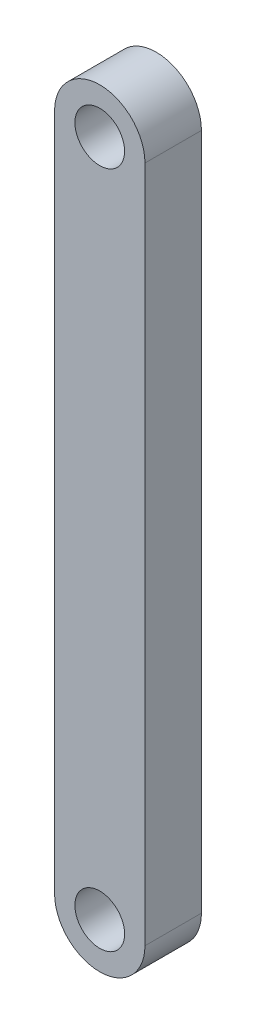
ISO-10303-21;
HEADER;
FILE_DESCRIPTION(('STEP AP214'),'2;1');
FILE_NAME('part.step','',(''),(''),'','','');
FILE_SCHEMA(('AUTOMOTIVE_DESIGN { 1 0 10303 214 1 1 1 1 }'));
ENDSEC;
DATA;
#1=APPLICATION_CONTEXT('core data for automotive mechanical design processes');
#2=APPLICATION_PROTOCOL_DEFINITION('international standard','automotive_design',2000,#1);
#3=PRODUCT_CONTEXT('',#1,'mechanical');
#4=PRODUCT('Part','Part','',(#3));
#5=PRODUCT_RELATED_PRODUCT_CATEGORY('part','',(#4));
#6=PRODUCT_DEFINITION_FORMATION('','',#4);
#7=PRODUCT_DEFINITION_CONTEXT('part definition',#1,'design');
#8=PRODUCT_DEFINITION('design','',#6,#7);
#9=PRODUCT_DEFINITION_SHAPE('','',#8);
#10=(LENGTH_UNIT() NAMED_UNIT(*) SI_UNIT(.MILLI.,.METRE.));
#11=(NAMED_UNIT(*) PLANE_ANGLE_UNIT() SI_UNIT($,.RADIAN.));
#12=(NAMED_UNIT(*) SI_UNIT($,.STERADIAN.) SOLID_ANGLE_UNIT());
#13=UNCERTAINTY_MEASURE_WITH_UNIT(LENGTH_MEASURE(1.E-05),#10,'distance_accuracy_value','');
#14=(GEOMETRIC_REPRESENTATION_CONTEXT(3) GLOBAL_UNCERTAINTY_ASSIGNED_CONTEXT((#13)) GLOBAL_UNIT_ASSIGNED_CONTEXT((#10,
#11,#12)) REPRESENTATION_CONTEXT('',''));
#15=CARTESIAN_POINT('',(0.,0.,0.));
#16=DIRECTION('',(0.,0.,1.));
#17=DIRECTION('',(1.,0.,0.));
#18=AXIS2_PLACEMENT_3D('',#15,#16,#17);
#19=CARTESIAN_POINT('',(0.,60.,5.));
#20=DIRECTION('',(0.,0.,1.));
#21=DIRECTION('',(1.,0.,0.));
#22=AXIS2_PLACEMENT_3D('',#19,#20,#21);
#23=PLANE('',#22);
#24=CARTESIAN_POINT('',(0.,0.,5.));
#25=DIRECTION('',(0.,0.,1.));
#26=DIRECTION('',(1.,0.,0.));
#27=AXIS2_PLACEMENT_3D('',#24,#25,#26);
#28=CIRCLE('',#27,2.2);
#29=CARTESIAN_POINT('',(2.2,0.,5.));
#30=VERTEX_POINT('',#29);
#31=EDGE_CURVE('E100',#30,#30,#28,.T.);
#32=ORIENTED_EDGE('',*,*,#31,.F.);
#33=EDGE_LOOP('',(#32));
#34=FACE_BOUND('',#33,.T.);
#35=CARTESIAN_POINT('',(0.,60.,5.));
#36=DIRECTION('',(0.,0.,1.));
#37=DIRECTION('',(1.,0.,0.));
#38=AXIS2_PLACEMENT_3D('',#35,#36,#37);
#39=CIRCLE('',#38,4.);
#40=CARTESIAN_POINT('',(3.99999999999999,60.,5.));
#41=VERTEX_POINT('',#40);
#42=CARTESIAN_POINT('',(-4.,60.,5.));
#43=VERTEX_POINT('',#42);
#44=EDGE_CURVE('E85',#41,#43,#39,.T.);
#45=ORIENTED_EDGE('',*,*,#44,.T.);
#46=DIRECTION('',(0.,-1.,0.));
#47=VECTOR('',#46,1.);
#48=CARTESIAN_POINT('',(-4.,60.,5.));
#49=LINE('',#48,#47);
#50=CARTESIAN_POINT('',(-4.,0.,5.));
#51=VERTEX_POINT('',#50);
#52=EDGE_CURVE('E80',#43,#51,#49,.T.);
#53=ORIENTED_EDGE('',*,*,#52,.T.);
#54=CARTESIAN_POINT('',(0.,0.,5.));
#55=DIRECTION('',(0.,0.,1.));
#56=DIRECTION('',(1.,0.,0.));
#57=AXIS2_PLACEMENT_3D('',#54,#55,#56);
#58=CIRCLE('',#57,4.);
#59=CARTESIAN_POINT('',(4.,0.,5.));
#60=VERTEX_POINT('',#59);
#61=EDGE_CURVE('E83',#51,#60,#58,.T.);
#62=ORIENTED_EDGE('',*,*,#61,.T.);
#63=DIRECTION('',(0.,1.,0.));
#64=VECTOR('',#63,1.);
#65=CARTESIAN_POINT('',(3.99999999999999,60.,5.));
#66=LINE('',#65,#64);
#67=EDGE_CURVE('E50',#60,#41,#66,.T.);
#68=ORIENTED_EDGE('',*,*,#67,.T.);
#69=EDGE_LOOP('',(#45,#53,#62,#68));
#70=FACE_BOUND('',#69,.T.);
#71=CARTESIAN_POINT('',(0.,60.,5.));
#72=DIRECTION('',(0.,0.,1.));
#73=DIRECTION('',(1.,0.,0.));
#74=AXIS2_PLACEMENT_3D('',#71,#72,#73);
#75=CIRCLE('',#74,2.2);
#76=CARTESIAN_POINT('',(2.2,60.,5.));
#77=VERTEX_POINT('',#76);
#78=EDGE_CURVE('E115',#77,#77,#75,.T.);
#79=ORIENTED_EDGE('',*,*,#78,.F.);
#80=EDGE_LOOP('',(#79));
#81=FACE_BOUND('',#80,.T.);
#82=ADVANCED_FACE('F33',(#34,#70,#81),#23,.T.);
#83=CARTESIAN_POINT('',(0.,60.,0.));
#84=DIRECTION('',(0.,0.,1.));
#85=DIRECTION('',(1.,0.,0.));
#86=AXIS2_PLACEMENT_3D('',#83,#84,#85);
#87=PLANE('',#86);
#88=CARTESIAN_POINT('',(0.,60.,0.));
#89=DIRECTION('',(0.,0.,1.));
#90=DIRECTION('',(1.,0.,0.));
#91=AXIS2_PLACEMENT_3D('',#88,#89,#90);
#92=CIRCLE('',#91,4.);
#93=CARTESIAN_POINT('',(3.99999999999999,60.,0.));
#94=VERTEX_POINT('',#93);
#95=CARTESIAN_POINT('',(-4.,60.,0.));
#96=VERTEX_POINT('',#95);
#97=EDGE_CURVE('E97',#94,#96,#92,.T.);
#98=ORIENTED_EDGE('',*,*,#97,.F.);
#99=DIRECTION('',(0.,1.,0.));
#100=VECTOR('',#99,1.);
#101=CARTESIAN_POINT('',(3.99999999999999,60.,0.));
#102=LINE('',#101,#100);
#103=CARTESIAN_POINT('',(4.,0.,0.));
#104=VERTEX_POINT('',#103);
#105=EDGE_CURVE('E73',#104,#94,#102,.T.);
#106=ORIENTED_EDGE('',*,*,#105,.F.);
#107=CARTESIAN_POINT('',(0.,0.,0.));
#108=DIRECTION('',(0.,0.,1.));
#109=DIRECTION('',(1.,0.,0.));
#110=AXIS2_PLACEMENT_3D('',#107,#108,#109);
#111=CIRCLE('',#110,4.);
#112=CARTESIAN_POINT('',(-4.,0.,0.));
#113=VERTEX_POINT('',#112);
#114=EDGE_CURVE('E67',#113,#104,#111,.T.);
#115=ORIENTED_EDGE('',*,*,#114,.F.);
#116=DIRECTION('',(0.,-1.,0.));
#117=VECTOR('',#116,1.);
#118=CARTESIAN_POINT('',(-4.,60.,0.));
#119=LINE('',#118,#117);
#120=EDGE_CURVE('E89',#96,#113,#119,.T.);
#121=ORIENTED_EDGE('',*,*,#120,.F.);
#122=EDGE_LOOP('',(#98,#106,#115,#121));
#123=FACE_BOUND('',#122,.T.);
#124=CARTESIAN_POINT('',(0.,0.,0.));
#125=DIRECTION('',(0.,0.,1.));
#126=DIRECTION('',(1.,0.,0.));
#127=AXIS2_PLACEMENT_3D('',#124,#125,#126);
#128=CIRCLE('',#127,2.2);
#129=CARTESIAN_POINT('',(2.2,0.,0.));
#130=VERTEX_POINT('',#129);
#131=EDGE_CURVE('E112',#130,#130,#128,.T.);
#132=ORIENTED_EDGE('',*,*,#131,.T.);
#133=EDGE_LOOP('',(#132));
#134=FACE_BOUND('',#133,.T.);
#135=CARTESIAN_POINT('',(0.,60.,0.));
#136=DIRECTION('',(0.,0.,1.));
#137=DIRECTION('',(1.,0.,0.));
#138=AXIS2_PLACEMENT_3D('',#135,#136,#137);
#139=CIRCLE('',#138,2.2);
#140=CARTESIAN_POINT('',(2.2,60.,0.));
#141=VERTEX_POINT('',#140);
#142=EDGE_CURVE('E118',#141,#141,#139,.T.);
#143=ORIENTED_EDGE('',*,*,#142,.T.);
#144=EDGE_LOOP('',(#143));
#145=FACE_BOUND('',#144,.T.);
#146=ADVANCED_FACE('F108',(#123,#134,#145),#87,.F.);
#147=CARTESIAN_POINT('',(0.,60.,5.));
#148=DIRECTION('',(0.,0.,-1.));
#149=DIRECTION('',(-1.,0.,0.));
#150=AXIS2_PLACEMENT_3D('',#147,#148,#149);
#151=CYLINDRICAL_SURFACE('',#150,4.);
#152=ORIENTED_EDGE('',*,*,#97,.T.);
#153=DIRECTION('',(0.,0.,-1.));
#154=VECTOR('',#153,1.);
#155=CARTESIAN_POINT('',(-4.,60.,5.));
#156=LINE('',#155,#154);
#157=EDGE_CURVE('E11',#43,#96,#156,.T.);
#158=ORIENTED_EDGE('',*,*,#157,.F.);
#159=ORIENTED_EDGE('',*,*,#44,.F.);
#160=DIRECTION('',(0.,0.,-1.));
#161=VECTOR('',#160,1.);
#162=CARTESIAN_POINT('',(3.99999999999999,60.,5.));
#163=LINE('',#162,#161);
#164=EDGE_CURVE('E93',#41,#94,#163,.T.);
#165=ORIENTED_EDGE('',*,*,#164,.T.);
#166=EDGE_LOOP('',(#152,#158,#159,#165));
#167=FACE_BOUND('',#166,.T.);
#168=ADVANCED_FACE('F35',(#167),#151,.T.);
#169=CARTESIAN_POINT('',(-4.,60.,5.));
#170=DIRECTION('',(1.,0.,0.));
#171=DIRECTION('',(0.,1.,0.));
#172=AXIS2_PLACEMENT_3D('',#169,#170,#171);
#173=PLANE('',#172);
#174=ORIENTED_EDGE('',*,*,#120,.T.);
#175=DIRECTION('',(0.,0.,-1.));
#176=VECTOR('',#175,1.);
#177=CARTESIAN_POINT('',(-4.,0.,5.));
#178=LINE('',#177,#176);
#179=EDGE_CURVE('E42',#51,#113,#178,.T.);
#180=ORIENTED_EDGE('',*,*,#179,.F.);
#181=ORIENTED_EDGE('',*,*,#52,.F.);
#182=ORIENTED_EDGE('',*,*,#157,.T.);
#183=EDGE_LOOP('',(#174,#180,#181,#182));
#184=FACE_BOUND('',#183,.T.);
#185=ADVANCED_FACE('F88',(#184),#173,.F.);
#186=CARTESIAN_POINT('',(0.,0.,5.));
#187=DIRECTION('',(0.,0.,-1.));
#188=DIRECTION('',(-1.,0.,0.));
#189=AXIS2_PLACEMENT_3D('',#186,#187,#188);
#190=CYLINDRICAL_SURFACE('',#189,4.);
#191=ORIENTED_EDGE('',*,*,#114,.T.);
#192=DIRECTION('',(0.,0.,-1.));
#193=VECTOR('',#192,1.);
#194=CARTESIAN_POINT('',(4.,0.,5.));
#195=LINE('',#194,#193);
#196=EDGE_CURVE('E90',#60,#104,#195,.T.);
#197=ORIENTED_EDGE('',*,*,#196,.F.);
#198=ORIENTED_EDGE('',*,*,#61,.F.);
#199=ORIENTED_EDGE('',*,*,#179,.T.);
#200=EDGE_LOOP('',(#191,#197,#198,#199));
#201=FACE_BOUND('',#200,.T.);
#202=ADVANCED_FACE('F91',(#201),#190,.T.);
#203=CARTESIAN_POINT('',(3.99999999999999,60.,5.));
#204=DIRECTION('',(-1.,0.,0.));
#205=DIRECTION('',(0.,-1.,0.));
#206=AXIS2_PLACEMENT_3D('',#203,#204,#205);
#207=PLANE('',#206);
#208=ORIENTED_EDGE('',*,*,#105,.T.);
#209=ORIENTED_EDGE('',*,*,#164,.F.);
#210=ORIENTED_EDGE('',*,*,#67,.F.);
#211=ORIENTED_EDGE('',*,*,#196,.T.);
#212=EDGE_LOOP('',(#208,#209,#210,#211));
#213=FACE_BOUND('',#212,.T.);
#214=ADVANCED_FACE('F105',(#213),#207,.F.);
#215=CARTESIAN_POINT('',(0.,0.,5.));
#216=DIRECTION('',(0.,0.,-1.));
#217=DIRECTION('',(-1.,0.,0.));
#218=AXIS2_PLACEMENT_3D('',#215,#216,#217);
#219=CYLINDRICAL_SURFACE('',#218,2.2);
#220=ORIENTED_EDGE('',*,*,#31,.T.);
#221=EDGE_LOOP('',(#220));
#222=FACE_BOUND('',#221,.T.);
#223=ORIENTED_EDGE('',*,*,#131,.F.);
#224=EDGE_LOOP('',(#223));
#225=FACE_BOUND('',#224,.T.);
#226=ADVANCED_FACE('F135',(#222,#225),#219,.F.);
#227=CARTESIAN_POINT('',(0.,60.,5.));
#228=DIRECTION('',(0.,0.,-1.));
#229=DIRECTION('',(-1.,0.,0.));
#230=AXIS2_PLACEMENT_3D('',#227,#228,#229);
#231=CYLINDRICAL_SURFACE('',#230,2.2);
#232=ORIENTED_EDGE('',*,*,#78,.T.);
#233=EDGE_LOOP('',(#232));
#234=FACE_BOUND('',#233,.T.);
#235=ORIENTED_EDGE('',*,*,#142,.F.);
#236=EDGE_LOOP('',(#235));
#237=FACE_BOUND('',#236,.T.);
#238=ADVANCED_FACE('F124',(#234,#237),#231,.F.);
#239=CLOSED_SHELL('',(#82,#146,#168,#185,#202,#214,#226,#238));
#240=MANIFOLD_SOLID_BREP('B2',#239);
#241=ADVANCED_BREP_SHAPE_REPRESENTATION('',(#18,#240),#14);
#242=SHAPE_DEFINITION_REPRESENTATION(#9,#241);
ENDSEC;
END-ISO-10303-21;
